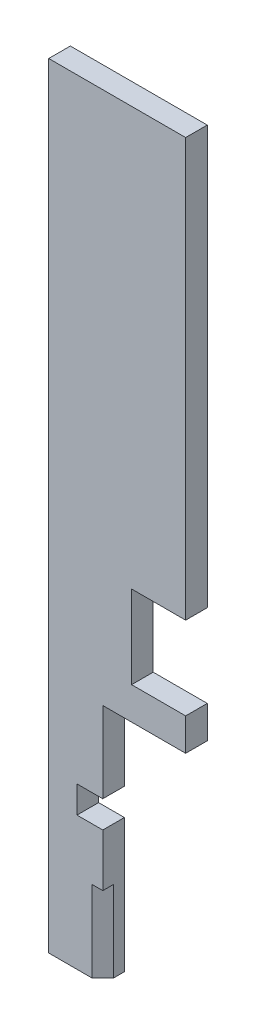
ISO-10303-21;
HEADER;
FILE_DESCRIPTION(('STEP AP214'),'2;1');
FILE_NAME('part.step','',(''),(''),'','','');
FILE_SCHEMA(('AUTOMOTIVE_DESIGN { 1 0 10303 214 1 1 1 1 }'));
ENDSEC;
DATA;
#1=APPLICATION_CONTEXT('core data for automotive mechanical design processes');
#2=APPLICATION_PROTOCOL_DEFINITION('international standard','automotive_design',2000,#1);
#3=PRODUCT_CONTEXT('',#1,'mechanical');
#4=PRODUCT('Part','Part','',(#3));
#5=PRODUCT_RELATED_PRODUCT_CATEGORY('part','',(#4));
#6=PRODUCT_DEFINITION_FORMATION('','',#4);
#7=PRODUCT_DEFINITION_CONTEXT('part definition',#1,'design');
#8=PRODUCT_DEFINITION('design','',#6,#7);
#9=PRODUCT_DEFINITION_SHAPE('','',#8);
#10=(LENGTH_UNIT() NAMED_UNIT(*) SI_UNIT(.MILLI.,.METRE.));
#11=(NAMED_UNIT(*) PLANE_ANGLE_UNIT() SI_UNIT($,.RADIAN.));
#12=(NAMED_UNIT(*) SI_UNIT($,.STERADIAN.) SOLID_ANGLE_UNIT());
#13=UNCERTAINTY_MEASURE_WITH_UNIT(LENGTH_MEASURE(1.E-05),#10,'distance_accuracy_value','');
#14=(GEOMETRIC_REPRESENTATION_CONTEXT(3) GLOBAL_UNCERTAINTY_ASSIGNED_CONTEXT((#13)) GLOBAL_UNIT_ASSIGNED_CONTEXT((#10,
#11,#12)) REPRESENTATION_CONTEXT('',''));
#15=CARTESIAN_POINT('',(0.,0.,0.));
#16=DIRECTION('',(0.,0.,1.));
#17=DIRECTION('',(1.,0.,0.));
#18=AXIS2_PLACEMENT_3D('',#15,#16,#17);
#19=CARTESIAN_POINT('',(15.,67.,6.));
#20=DIRECTION('',(-1.,0.,0.));
#21=DIRECTION('',(0.,-1.,0.));
#22=AXIS2_PLACEMENT_3D('',#19,#20,#21);
#23=PLANE('',#22);
#24=DIRECTION('',(0.,1.,0.));
#25=VECTOR('',#24,1.);
#26=CARTESIAN_POINT('',(15.,67.,6.));
#27=LINE('',#26,#25);
#28=CARTESIAN_POINT('',(15.,44.5754257850093,6.));
#29=VERTEX_POINT('',#28);
#30=CARTESIAN_POINT('',(15.,67.,6.));
#31=VERTEX_POINT('',#30);
#32=EDGE_CURVE('E188',#29,#31,#27,.T.);
#33=ORIENTED_EDGE('',*,*,#32,.F.);
#34=DIRECTION('',(0.,0.,-1.));
#35=VECTOR('',#34,1.);
#36=CARTESIAN_POINT('',(15.,44.5754257850093,6.));
#37=LINE('',#36,#35);
#38=CARTESIAN_POINT('',(15.,44.5754257850093,0.));
#39=VERTEX_POINT('',#38);
#40=EDGE_CURVE('E180',#29,#39,#37,.T.);
#41=ORIENTED_EDGE('',*,*,#40,.T.);
#42=DIRECTION('',(0.,1.,0.));
#43=VECTOR('',#42,1.);
#44=CARTESIAN_POINT('',(15.,67.,0.));
#45=LINE('',#44,#43);
#46=CARTESIAN_POINT('',(15.,67.,0.));
#47=VERTEX_POINT('',#46);
#48=EDGE_CURVE('E183',#39,#47,#45,.T.);
#49=ORIENTED_EDGE('',*,*,#48,.T.);
#50=DIRECTION('',(0.,0.,-1.));
#51=VECTOR('',#50,1.);
#52=CARTESIAN_POINT('',(15.,67.,6.));
#53=LINE('',#52,#51);
#54=EDGE_CURVE('E200',#31,#47,#53,.T.);
#55=ORIENTED_EDGE('',*,*,#54,.F.);
#56=EDGE_LOOP('',(#33,#41,#49,#55));
#57=FACE_BOUND('',#56,.T.);
#58=ADVANCED_FACE('F35',(#57),#23,.F.);
#59=CARTESIAN_POINT('',(38.,215.,6.));
#60=DIRECTION('',(-1.,0.,0.));
#61=DIRECTION('',(0.,-1.,0.));
#62=AXIS2_PLACEMENT_3D('',#59,#60,#61);
#63=PLANE('',#62);
#64=DIRECTION('',(0.,1.,0.));
#65=VECTOR('',#64,1.);
#66=CARTESIAN_POINT('',(38.,215.,6.));
#67=LINE('',#66,#65);
#68=CARTESIAN_POINT('',(38.0000000000079,99.0000000000011,6.));
#69=VERTEX_POINT('',#68);
#70=CARTESIAN_POINT('',(38.,215.,6.));
#71=VERTEX_POINT('',#70);
#72=EDGE_CURVE('E238',#69,#71,#67,.T.);
#73=ORIENTED_EDGE('',*,*,#72,.F.);
#74=DIRECTION('',(0.,0.,-1.));
#75=VECTOR('',#74,1.);
#76=CARTESIAN_POINT('',(38.0000000000079,99.0000000000011,6.));
#77=LINE('',#76,#75);
#78=CARTESIAN_POINT('',(38.0000000000079,99.0000000000011,0.));
#79=VERTEX_POINT('',#78);
#80=EDGE_CURVE('E225',#69,#79,#77,.T.);
#81=ORIENTED_EDGE('',*,*,#80,.T.);
#82=DIRECTION('',(0.,1.,0.));
#83=VECTOR('',#82,1.);
#84=CARTESIAN_POINT('',(38.,215.,0.));
#85=LINE('',#84,#83);
#86=CARTESIAN_POINT('',(38.,215.,0.));
#87=VERTEX_POINT('',#86);
#88=EDGE_CURVE('E249',#79,#87,#85,.T.);
#89=ORIENTED_EDGE('',*,*,#88,.T.);
#90=DIRECTION('',(0.,0.,-1.));
#91=VECTOR('',#90,1.);
#92=CARTESIAN_POINT('',(38.,215.,6.));
#93=LINE('',#92,#91);
#94=EDGE_CURVE('E260',#71,#87,#93,.T.);
#95=ORIENTED_EDGE('',*,*,#94,.F.);
#96=EDGE_LOOP('',(#73,#81,#89,#95));
#97=FACE_BOUND('',#96,.T.);
#98=ADVANCED_FACE('F316',(#97),#63,.F.);
#99=CARTESIAN_POINT('',(38.,0.,6.));
#100=DIRECTION('',(0.,1.,0.));
#101=DIRECTION('',(-1.,0.,0.));
#102=AXIS2_PLACEMENT_3D('',#99,#100,#101);
#103=PLANE('',#102);
#104=CARTESIAN_POINT('',(6.,0.,3.));
#105=DIRECTION('',(0.,-1.,0.));
#106=DIRECTION('',(1.,0.,0.));
#107=AXIS2_PLACEMENT_3D('',#104,#105,#106);
#108=CIRCLE('',#107,2.5);
#109=CARTESIAN_POINT('',(8.5,0.,3.));
#110=VERTEX_POINT('',#109);
#111=EDGE_CURVE('E173',#110,#110,#108,.T.);
#112=ORIENTED_EDGE('',*,*,#111,.F.);
#113=EDGE_LOOP('',(#112));
#114=FACE_BOUND('',#113,.T.);
#115=DIRECTION('',(1.,0.,0.));
#116=VECTOR('',#115,1.);
#117=CARTESIAN_POINT('',(38.,0.,0.));
#118=LINE('',#117,#116);
#119=CARTESIAN_POINT('',(0.,0.,0.));
#120=VERTEX_POINT('',#119);
#121=CARTESIAN_POINT('',(15.,0.,0.));
#122=VERTEX_POINT('',#121);
#123=EDGE_CURVE('E228',#120,#122,#118,.T.);
#124=ORIENTED_EDGE('',*,*,#123,.T.);
#125=DIRECTION('',(0.,0.,-1.));
#126=VECTOR('',#125,1.);
#127=CARTESIAN_POINT('',(15.,0.,6.));
#128=LINE('',#127,#126);
#129=CARTESIAN_POINT('',(15.,0.,3.00000000000002));
#130=VERTEX_POINT('',#129);
#131=EDGE_CURVE('E191',#130,#122,#128,.T.);
#132=ORIENTED_EDGE('',*,*,#131,.F.);
#133=DIRECTION('',(0.707106781186549,0.,-0.707106781186546));
#134=VECTOR('',#133,1.);
#135=CARTESIAN_POINT('',(18.,0.,0.));
#136=LINE('',#135,#134);
#137=CARTESIAN_POINT('',(12.,0.,6.));
#138=VERTEX_POINT('',#137);
#139=EDGE_CURVE('E263',#130,#138,#136,.F.);
#140=ORIENTED_EDGE('',*,*,#139,.T.);
#141=DIRECTION('',(1.,0.,0.));
#142=VECTOR('',#141,1.);
#143=CARTESIAN_POINT('',(38.,0.,6.));
#144=LINE('',#143,#142);
#145=CARTESIAN_POINT('',(0.,0.,6.));
#146=VERTEX_POINT('',#145);
#147=EDGE_CURVE('E235',#146,#138,#144,.T.);
#148=ORIENTED_EDGE('',*,*,#147,.F.);
#149=DIRECTION('',(0.,0.,-1.));
#150=VECTOR('',#149,1.);
#151=CARTESIAN_POINT('',(0.,0.,6.));
#152=LINE('',#151,#150);
#153=EDGE_CURVE('E246',#146,#120,#152,.T.);
#154=ORIENTED_EDGE('',*,*,#153,.T.);
#155=EDGE_LOOP('',(#124,#132,#140,#148,#154));
#156=FACE_BOUND('',#155,.T.);
#157=ADVANCED_FACE('F278',(#114,#156),#103,.F.);
#158=CARTESIAN_POINT('',(38.,67.,6.));
#159=VERTEX_POINT('',#158);
#160=CARTESIAN_POINT('',(38.0000000000079,76.0000000000011,6.));
#161=VERTEX_POINT('',#160);
#162=EDGE_CURVE('E240',#159,#161,#67,.T.);
#163=ORIENTED_EDGE('',*,*,#162,.F.);
#164=DIRECTION('',(0.,0.,-1.));
#165=VECTOR('',#164,1.);
#166=CARTESIAN_POINT('',(38.,67.,6.));
#167=LINE('',#166,#165);
#168=CARTESIAN_POINT('',(38.,67.,0.));
#169=VERTEX_POINT('',#168);
#170=EDGE_CURVE('E197',#159,#169,#167,.T.);
#171=ORIENTED_EDGE('',*,*,#170,.T.);
#172=CARTESIAN_POINT('',(38.,76.0000000000011,0.));
#173=VERTEX_POINT('',#172);
#174=EDGE_CURVE('E250',#169,#173,#85,.T.);
#175=ORIENTED_EDGE('',*,*,#174,.T.);
#176=DIRECTION('',(0.,0.,-1.));
#177=VECTOR('',#176,1.);
#178=CARTESIAN_POINT('',(38.0000000000079,76.0000000000011,6.));
#179=LINE('',#178,#177);
#180=EDGE_CURVE('E218',#161,#173,#179,.T.);
#181=ORIENTED_EDGE('',*,*,#180,.F.);
#182=EDGE_LOOP('',(#163,#171,#175,#181));
#183=FACE_BOUND('',#182,.T.);
#184=ADVANCED_FACE('F300',(#183),#63,.F.);
#185=CARTESIAN_POINT('',(0.,215.,6.));
#186=DIRECTION('',(0.,-1.,0.));
#187=DIRECTION('',(0.,0.,-1.));
#188=AXIS2_PLACEMENT_3D('',#185,#186,#187);
#189=PLANE('',#188);
#190=DIRECTION('',(-1.,0.,0.));
#191=VECTOR('',#190,1.);
#192=CARTESIAN_POINT('',(0.,215.,0.));
#193=LINE('',#192,#191);
#194=CARTESIAN_POINT('',(0.,215.,0.));
#195=VERTEX_POINT('',#194);
#196=EDGE_CURVE('E252',#87,#195,#193,.T.);
#197=ORIENTED_EDGE('',*,*,#196,.T.);
#198=DIRECTION('',(0.,0.,-1.));
#199=VECTOR('',#198,1.);
#200=CARTESIAN_POINT('',(0.,215.,6.));
#201=LINE('',#200,#199);
#202=CARTESIAN_POINT('',(0.,215.,6.));
#203=VERTEX_POINT('',#202);
#204=EDGE_CURVE('E257',#203,#195,#201,.T.);
#205=ORIENTED_EDGE('',*,*,#204,.F.);
#206=DIRECTION('',(-1.,0.,0.));
#207=VECTOR('',#206,1.);
#208=CARTESIAN_POINT('',(0.,215.,6.));
#209=LINE('',#208,#207);
#210=EDGE_CURVE('E242',#71,#203,#209,.T.);
#211=ORIENTED_EDGE('',*,*,#210,.F.);
#212=ORIENTED_EDGE('',*,*,#94,.T.);
#213=EDGE_LOOP('',(#197,#205,#211,#212));
#214=FACE_BOUND('',#213,.T.);
#215=ADVANCED_FACE('F320',(#214),#189,.F.);
#216=CARTESIAN_POINT('',(0.,0.,6.));
#217=DIRECTION('',(1.,0.,0.));
#218=DIRECTION('',(0.,0.,-1.));
#219=AXIS2_PLACEMENT_3D('',#216,#217,#218);
#220=PLANE('',#219);
#221=DIRECTION('',(0.,-1.,0.));
#222=VECTOR('',#221,1.);
#223=CARTESIAN_POINT('',(0.,0.,0.));
#224=LINE('',#223,#222);
#225=EDGE_CURVE('E239',#195,#120,#224,.T.);
#226=ORIENTED_EDGE('',*,*,#225,.T.);
#227=ORIENTED_EDGE('',*,*,#153,.F.);
#228=DIRECTION('',(0.,-1.,0.));
#229=VECTOR('',#228,1.);
#230=CARTESIAN_POINT('',(0.,0.,6.));
#231=LINE('',#230,#229);
#232=EDGE_CURVE('E244',#203,#146,#231,.T.);
#233=ORIENTED_EDGE('',*,*,#232,.F.);
#234=ORIENTED_EDGE('',*,*,#204,.T.);
#235=EDGE_LOOP('',(#226,#227,#233,#234));
#236=FACE_BOUND('',#235,.T.);
#237=ADVANCED_FACE('F323',(#236),#220,.F.);
#238=CARTESIAN_POINT('',(0.,0.,6.));
#239=DIRECTION('',(0.,0.,-1.));
#240=DIRECTION('',(-1.,0.,0.));
#241=AXIS2_PLACEMENT_3D('',#238,#239,#240);
#242=PLANE('',#241);
#243=DIRECTION('',(0.,1.,0.));
#244=VECTOR('',#243,1.);
#245=CARTESIAN_POINT('',(7.84125154152271,44.5754257850093,6.));
#246=LINE('',#245,#244);
#247=CARTESIAN_POINT('',(7.84125154152271,37.0754257850093,6.));
#248=VERTEX_POINT('',#247);
#249=CARTESIAN_POINT('',(7.84125154152271,44.5754257850093,6.));
#250=VERTEX_POINT('',#249);
#251=EDGE_CURVE('E157',#248,#250,#246,.T.);
#252=ORIENTED_EDGE('',*,*,#251,.T.);
#253=DIRECTION('',(1.,0.,0.));
#254=VECTOR('',#253,1.);
#255=CARTESIAN_POINT('',(15.,44.5754257850093,6.));
#256=LINE('',#255,#254);
#257=EDGE_CURVE('E162',#250,#29,#256,.T.);
#258=ORIENTED_EDGE('',*,*,#257,.T.);
#259=ORIENTED_EDGE('',*,*,#32,.T.);
#260=DIRECTION('',(1.,0.,0.));
#261=VECTOR('',#260,1.);
#262=CARTESIAN_POINT('',(38.,67.,6.));
#263=LINE('',#262,#261);
#264=EDGE_CURVE('E187',#31,#159,#263,.T.);
#265=ORIENTED_EDGE('',*,*,#264,.T.);
#266=ORIENTED_EDGE('',*,*,#162,.T.);
#267=DIRECTION('',(-1.,0.,0.));
#268=VECTOR('',#267,1.);
#269=CARTESIAN_POINT('',(38.0000000000079,76.0000000000011,6.));
#270=LINE('',#269,#268);
#271=CARTESIAN_POINT('',(23.0000000000079,76.0000000000011,6.));
#272=VERTEX_POINT('',#271);
#273=EDGE_CURVE('E208',#161,#272,#270,.T.);
#274=ORIENTED_EDGE('',*,*,#273,.T.);
#275=DIRECTION('',(0.,1.,0.));
#276=VECTOR('',#275,1.);
#277=CARTESIAN_POINT('',(23.0000000000079,76.0000000000011,6.));
#278=LINE('',#277,#276);
#279=CARTESIAN_POINT('',(23.0000000000079,99.0000000000011,6.));
#280=VERTEX_POINT('',#279);
#281=EDGE_CURVE('E211',#272,#280,#278,.T.);
#282=ORIENTED_EDGE('',*,*,#281,.T.);
#283=DIRECTION('',(1.,0.,0.));
#284=VECTOR('',#283,1.);
#285=CARTESIAN_POINT('',(38.0000000000079,99.0000000000011,6.));
#286=LINE('',#285,#284);
#287=EDGE_CURVE('E215',#280,#69,#286,.T.);
#288=ORIENTED_EDGE('',*,*,#287,.T.);
#289=ORIENTED_EDGE('',*,*,#72,.T.);
#290=ORIENTED_EDGE('',*,*,#210,.T.);
#291=ORIENTED_EDGE('',*,*,#232,.T.);
#292=ORIENTED_EDGE('',*,*,#147,.T.);
#293=DIRECTION('',(0.,1.,0.));
#294=VECTOR('',#293,1.);
#295=CARTESIAN_POINT('',(12.,0.,6.));
#296=LINE('',#295,#294);
#297=CARTESIAN_POINT('',(12.,22.5,6.));
#298=VERTEX_POINT('',#297);
#299=EDGE_CURVE('E265',#138,#298,#296,.T.);
#300=ORIENTED_EDGE('',*,*,#299,.T.);
#301=DIRECTION('',(-1.,0.,0.));
#302=VECTOR('',#301,1.);
#303=CARTESIAN_POINT('',(38.,22.5,6.));
#304=LINE('',#303,#302);
#305=CARTESIAN_POINT('',(15.,22.5,6.));
#306=VERTEX_POINT('',#305);
#307=EDGE_CURVE('E205',#306,#298,#304,.T.);
#308=ORIENTED_EDGE('',*,*,#307,.F.);
#309=CARTESIAN_POINT('',(15.,37.0754257850093,6.));
#310=VERTEX_POINT('',#309);
#311=EDGE_CURVE('E167',#306,#310,#27,.T.);
#312=ORIENTED_EDGE('',*,*,#311,.T.);
#313=DIRECTION('',(-1.,0.,0.));
#314=VECTOR('',#313,1.);
#315=CARTESIAN_POINT('',(15.,37.0754257850093,6.));
#316=LINE('',#315,#314);
#317=EDGE_CURVE('E50',#310,#248,#316,.T.);
#318=ORIENTED_EDGE('',*,*,#317,.T.);
#319=EDGE_LOOP('',(#252,#258,#259,#265,#266,#274,#282,#288,#289,#290,#291,#292,#300,#308,#312,#318));
#320=FACE_BOUND('',#319,.T.);
#321=ADVANCED_FACE('F165',(#320),#242,.F.);
#322=CARTESIAN_POINT('',(0.,0.,0.));
#323=DIRECTION('',(0.,0.,-1.));
#324=DIRECTION('',(-1.,0.,0.));
#325=AXIS2_PLACEMENT_3D('',#322,#323,#324);
#326=PLANE('',#325);
#327=DIRECTION('',(1.,0.,0.));
#328=VECTOR('',#327,1.);
#329=CARTESIAN_POINT('',(15.,44.5754257850093,0.));
#330=LINE('',#329,#328);
#331=CARTESIAN_POINT('',(7.84125154152271,44.5754257850093,0.));
#332=VERTEX_POINT('',#331);
#333=EDGE_CURVE('E168',#332,#39,#330,.T.);
#334=ORIENTED_EDGE('',*,*,#333,.F.);
#335=DIRECTION('',(0.,1.,0.));
#336=VECTOR('',#335,1.);
#337=CARTESIAN_POINT('',(7.84125154152271,44.5754257850093,0.));
#338=LINE('',#337,#336);
#339=CARTESIAN_POINT('',(7.84125154152271,37.0754257850093,0.));
#340=VERTEX_POINT('',#339);
#341=EDGE_CURVE('E170',#340,#332,#338,.T.);
#342=ORIENTED_EDGE('',*,*,#341,.F.);
#343=DIRECTION('',(-1.,0.,0.));
#344=VECTOR('',#343,1.);
#345=CARTESIAN_POINT('',(15.,37.0754257850093,0.));
#346=LINE('',#345,#344);
#347=CARTESIAN_POINT('',(15.,37.0754257850093,0.));
#348=VERTEX_POINT('',#347);
#349=EDGE_CURVE('E149',#348,#340,#346,.T.);
#350=ORIENTED_EDGE('',*,*,#349,.F.);
#351=EDGE_CURVE('E192',#122,#348,#45,.T.);
#352=ORIENTED_EDGE('',*,*,#351,.F.);
#353=ORIENTED_EDGE('',*,*,#123,.F.);
#354=ORIENTED_EDGE('',*,*,#225,.F.);
#355=ORIENTED_EDGE('',*,*,#196,.F.);
#356=ORIENTED_EDGE('',*,*,#88,.F.);
#357=DIRECTION('',(1.,0.,0.));
#358=VECTOR('',#357,1.);
#359=CARTESIAN_POINT('',(38.0000000000079,99.0000000000011,0.));
#360=LINE('',#359,#358);
#361=CARTESIAN_POINT('',(23.0000000000079,99.0000000000011,0.));
#362=VERTEX_POINT('',#361);
#363=EDGE_CURVE('E212',#362,#79,#360,.T.);
#364=ORIENTED_EDGE('',*,*,#363,.F.);
#365=DIRECTION('',(0.,1.,0.));
#366=VECTOR('',#365,1.);
#367=CARTESIAN_POINT('',(23.0000000000079,76.0000000000011,0.));
#368=LINE('',#367,#366);
#369=CARTESIAN_POINT('',(23.0000000000079,76.0000000000011,0.));
#370=VERTEX_POINT('',#369);
#371=EDGE_CURVE('E221',#370,#362,#368,.T.);
#372=ORIENTED_EDGE('',*,*,#371,.F.);
#373=DIRECTION('',(-1.,0.,0.));
#374=VECTOR('',#373,1.);
#375=CARTESIAN_POINT('',(38.0000000000079,76.0000000000011,0.));
#376=LINE('',#375,#374);
#377=EDGE_CURVE('E207',#173,#370,#376,.T.);
#378=ORIENTED_EDGE('',*,*,#377,.F.);
#379=ORIENTED_EDGE('',*,*,#174,.F.);
#380=DIRECTION('',(1.,0.,0.));
#381=VECTOR('',#380,1.);
#382=CARTESIAN_POINT('',(38.,67.,0.));
#383=LINE('',#382,#381);
#384=EDGE_CURVE('E195',#47,#169,#383,.T.);
#385=ORIENTED_EDGE('',*,*,#384,.F.);
#386=ORIENTED_EDGE('',*,*,#48,.F.);
#387=EDGE_LOOP('',(#334,#342,#350,#352,#353,#354,#355,#356,#364,#372,#378,#379,#385,#386));
#388=FACE_BOUND('',#387,.T.);
#389=ADVANCED_FACE('F285',(#388),#326,.T.);
#390=CARTESIAN_POINT('',(38.0000000000079,99.0000000000011,6.));
#391=DIRECTION('',(0.,1.,0.));
#392=DIRECTION('',(0.,0.,1.));
#393=AXIS2_PLACEMENT_3D('',#390,#391,#392);
#394=PLANE('',#393);
#395=ORIENTED_EDGE('',*,*,#363,.T.);
#396=ORIENTED_EDGE('',*,*,#80,.F.);
#397=ORIENTED_EDGE('',*,*,#287,.F.);
#398=DIRECTION('',(0.,0.,-1.));
#399=VECTOR('',#398,1.);
#400=CARTESIAN_POINT('',(23.0000000000079,99.0000000000011,6.));
#401=LINE('',#400,#399);
#402=EDGE_CURVE('E229',#280,#362,#401,.T.);
#403=ORIENTED_EDGE('',*,*,#402,.T.);
#404=EDGE_LOOP('',(#395,#396,#397,#403));
#405=FACE_BOUND('',#404,.T.);
#406=ADVANCED_FACE('F355',(#405),#394,.F.);
#407=CARTESIAN_POINT('',(23.0000000000079,76.0000000000011,6.));
#408=DIRECTION('',(-1.,0.,0.));
#409=DIRECTION('',(0.,0.,1.));
#410=AXIS2_PLACEMENT_3D('',#407,#408,#409);
#411=PLANE('',#410);
#412=ORIENTED_EDGE('',*,*,#371,.T.);
#413=ORIENTED_EDGE('',*,*,#402,.F.);
#414=ORIENTED_EDGE('',*,*,#281,.F.);
#415=DIRECTION('',(0.,0.,-1.));
#416=VECTOR('',#415,1.);
#417=CARTESIAN_POINT('',(23.0000000000079,76.0000000000011,6.));
#418=LINE('',#417,#416);
#419=EDGE_CURVE('E231',#272,#370,#418,.T.);
#420=ORIENTED_EDGE('',*,*,#419,.T.);
#421=EDGE_LOOP('',(#412,#413,#414,#420));
#422=FACE_BOUND('',#421,.T.);
#423=ADVANCED_FACE('F309',(#422),#411,.F.);
#424=CARTESIAN_POINT('',(38.0000000000079,76.0000000000011,6.));
#425=DIRECTION('',(0.,-1.,0.));
#426=DIRECTION('',(0.,0.,-1.));
#427=AXIS2_PLACEMENT_3D('',#424,#425,#426);
#428=PLANE('',#427);
#429=ORIENTED_EDGE('',*,*,#377,.T.);
#430=ORIENTED_EDGE('',*,*,#419,.F.);
#431=ORIENTED_EDGE('',*,*,#273,.F.);
#432=ORIENTED_EDGE('',*,*,#180,.T.);
#433=EDGE_LOOP('',(#429,#430,#431,#432));
#434=FACE_BOUND('',#433,.T.);
#435=ADVANCED_FACE('F304',(#434),#428,.F.);
#436=CARTESIAN_POINT('',(38.,22.5,-1.5));
#437=DIRECTION('',(0.,1.,0.));
#438=DIRECTION('',(0.,0.,1.));
#439=AXIS2_PLACEMENT_3D('',#436,#437,#438);
#440=PLANE('',#439);
#441=DIRECTION('',(-0.707106781186549,0.,0.707106781186546));
#442=VECTOR('',#441,1.);
#443=CARTESIAN_POINT('',(28.7500000000001,22.5,-10.75));
#444=LINE('',#443,#442);
#445=CARTESIAN_POINT('',(15.,22.5,3.00000000000002));
#446=VERTEX_POINT('',#445);
#447=EDGE_CURVE('E43',#298,#446,#444,.F.);
#448=ORIENTED_EDGE('',*,*,#447,.T.);
#449=DIRECTION('',(0.,0.,1.));
#450=VECTOR('',#449,1.);
#451=CARTESIAN_POINT('',(15.,22.5,-1.5));
#452=LINE('',#451,#450);
#453=EDGE_CURVE('E57',#446,#306,#452,.T.);
#454=ORIENTED_EDGE('',*,*,#453,.T.);
#455=ORIENTED_EDGE('',*,*,#307,.T.);
#456=EDGE_LOOP('',(#448,#454,#455));
#457=FACE_BOUND('',#456,.T.);
#458=ADVANCED_FACE('F270',(#457),#440,.F.);
#459=CARTESIAN_POINT('',(18.,0.,0.));
#460=DIRECTION('',(-0.707106781186546,0.,-0.707106781186549));
#461=DIRECTION('',(0.,-1.,0.));
#462=AXIS2_PLACEMENT_3D('',#459,#460,#461);
#463=PLANE('',#462);
#464=DIRECTION('',(0.,1.,0.));
#465=VECTOR('',#464,1.);
#466=CARTESIAN_POINT('',(15.,0.,3.00000000000002));
#467=LINE('',#466,#465);
#468=EDGE_CURVE('E11',#446,#130,#467,.F.);
#469=ORIENTED_EDGE('',*,*,#468,.F.);
#470=ORIENTED_EDGE('',*,*,#447,.F.);
#471=ORIENTED_EDGE('',*,*,#299,.F.);
#472=ORIENTED_EDGE('',*,*,#139,.F.);
#473=EDGE_LOOP('',(#469,#470,#471,#472));
#474=FACE_BOUND('',#473,.T.);
#475=ADVANCED_FACE('F37',(#474),#463,.F.);
#476=ORIENTED_EDGE('',*,*,#351,.T.);
#477=DIRECTION('',(0.,0.,-1.));
#478=VECTOR('',#477,1.);
#479=CARTESIAN_POINT('',(15.,37.0754257850093,6.));
#480=LINE('',#479,#478);
#481=EDGE_CURVE('E154',#310,#348,#480,.T.);
#482=ORIENTED_EDGE('',*,*,#481,.F.);
#483=ORIENTED_EDGE('',*,*,#311,.F.);
#484=ORIENTED_EDGE('',*,*,#453,.F.);
#485=ORIENTED_EDGE('',*,*,#468,.T.);
#486=ORIENTED_EDGE('',*,*,#131,.T.);
#487=EDGE_LOOP('',(#476,#482,#483,#484,#485,#486));
#488=FACE_BOUND('',#487,.T.);
#489=ADVANCED_FACE('F275',(#488),#23,.F.);
#490=CARTESIAN_POINT('',(38.,67.,6.));
#491=DIRECTION('',(0.,1.,0.));
#492=DIRECTION('',(0.,0.,1.));
#493=AXIS2_PLACEMENT_3D('',#490,#491,#492);
#494=PLANE('',#493);
#495=ORIENTED_EDGE('',*,*,#384,.T.);
#496=ORIENTED_EDGE('',*,*,#170,.F.);
#497=ORIENTED_EDGE('',*,*,#264,.F.);
#498=ORIENTED_EDGE('',*,*,#54,.T.);
#499=EDGE_LOOP('',(#495,#496,#497,#498));
#500=FACE_BOUND('',#499,.T.);
#501=ADVANCED_FACE('F342',(#500),#494,.F.);
#502=CARTESIAN_POINT('',(15.,44.5754257850093,6.));
#503=DIRECTION('',(0.,1.,0.));
#504=DIRECTION('',(0.,0.,1.));
#505=AXIS2_PLACEMENT_3D('',#502,#503,#504);
#506=PLANE('',#505);
#507=ORIENTED_EDGE('',*,*,#333,.T.);
#508=ORIENTED_EDGE('',*,*,#40,.F.);
#509=ORIENTED_EDGE('',*,*,#257,.F.);
#510=DIRECTION('',(0.,0.,-1.));
#511=VECTOR('',#510,1.);
#512=CARTESIAN_POINT('',(7.84125154152271,44.5754257850093,6.));
#513=LINE('',#512,#511);
#514=EDGE_CURVE('E153',#250,#332,#513,.T.);
#515=ORIENTED_EDGE('',*,*,#514,.T.);
#516=EDGE_LOOP('',(#507,#508,#509,#515));
#517=FACE_BOUND('',#516,.T.);
#518=ADVANCED_FACE('F290',(#517),#506,.F.);
#519=CARTESIAN_POINT('',(7.84125154152271,44.5754257850093,6.));
#520=DIRECTION('',(-1.,0.,0.));
#521=DIRECTION('',(0.,0.,1.));
#522=AXIS2_PLACEMENT_3D('',#519,#520,#521);
#523=PLANE('',#522);
#524=ORIENTED_EDGE('',*,*,#341,.T.);
#525=ORIENTED_EDGE('',*,*,#514,.F.);
#526=ORIENTED_EDGE('',*,*,#251,.F.);
#527=DIRECTION('',(0.,0.,-1.));
#528=VECTOR('',#527,1.);
#529=CARTESIAN_POINT('',(7.84125154152271,37.0754257850093,6.));
#530=LINE('',#529,#528);
#531=EDGE_CURVE('E145',#248,#340,#530,.T.);
#532=ORIENTED_EDGE('',*,*,#531,.T.);
#533=EDGE_LOOP('',(#524,#525,#526,#532));
#534=FACE_BOUND('',#533,.T.);
#535=ADVANCED_FACE('F158',(#534),#523,.F.);
#536=CARTESIAN_POINT('',(15.,37.0754257850093,6.));
#537=DIRECTION('',(0.,-1.,0.));
#538=DIRECTION('',(0.,0.,-1.));
#539=AXIS2_PLACEMENT_3D('',#536,#537,#538);
#540=PLANE('',#539);
#541=ORIENTED_EDGE('',*,*,#349,.T.);
#542=ORIENTED_EDGE('',*,*,#531,.F.);
#543=ORIENTED_EDGE('',*,*,#317,.F.);
#544=ORIENTED_EDGE('',*,*,#481,.T.);
#545=EDGE_LOOP('',(#541,#542,#543,#544));
#546=FACE_BOUND('',#545,.T.);
#547=ADVANCED_FACE('F147',(#546),#540,.F.);
#548=CARTESIAN_POINT('',(6.,10.,3.));
#549=DIRECTION('',(0.,-1.,0.));
#550=DIRECTION('',(1.,0.,0.));
#551=AXIS2_PLACEMENT_3D('',#548,#549,#550);
#552=CYLINDRICAL_SURFACE('',#551,2.5);
#553=CARTESIAN_POINT('',(6.,10.,3.));
#554=DIRECTION('',(0.,-1.,0.));
#555=DIRECTION('',(1.,0.,0.));
#556=AXIS2_PLACEMENT_3D('',#553,#554,#555);
#557=CIRCLE('',#556,2.5);
#558=CARTESIAN_POINT('',(8.5,10.,3.));
#559=VERTEX_POINT('',#558);
#560=EDGE_CURVE('E178',#559,#559,#557,.T.);
#561=ORIENTED_EDGE('',*,*,#560,.F.);
#562=EDGE_LOOP('',(#561));
#563=FACE_BOUND('',#562,.T.);
#564=ORIENTED_EDGE('',*,*,#111,.T.);
#565=EDGE_LOOP('',(#564));
#566=FACE_BOUND('',#565,.T.);
#567=ADVANCED_FACE('F448',(#563,#566),#552,.F.);
#568=CARTESIAN_POINT('',(6.,10.,3.));
#569=DIRECTION('',(0.,-1.,0.));
#570=DIRECTION('',(1.,0.,0.));
#571=AXIS2_PLACEMENT_3D('',#568,#569,#570);
#572=PLANE('',#571);
#573=ORIENTED_EDGE('',*,*,#560,.T.);
#574=EDGE_LOOP('',(#573));
#575=FACE_BOUND('',#574,.T.);
#576=ADVANCED_FACE('F453',(#575),#572,.T.);
#577=CLOSED_SHELL('',(#58,#98,#157,#184,#215,#237,#321,#389,#406,#423,#435,#458,#475,#489,#501,
#518,#535,#547,#567,#576));
#578=MANIFOLD_SOLID_BREP('B2',#577);
#579=ADVANCED_BREP_SHAPE_REPRESENTATION('',(#18,#578),#14);
#580=SHAPE_DEFINITION_REPRESENTATION(#9,#579);
ENDSEC;
END-ISO-10303-21;
